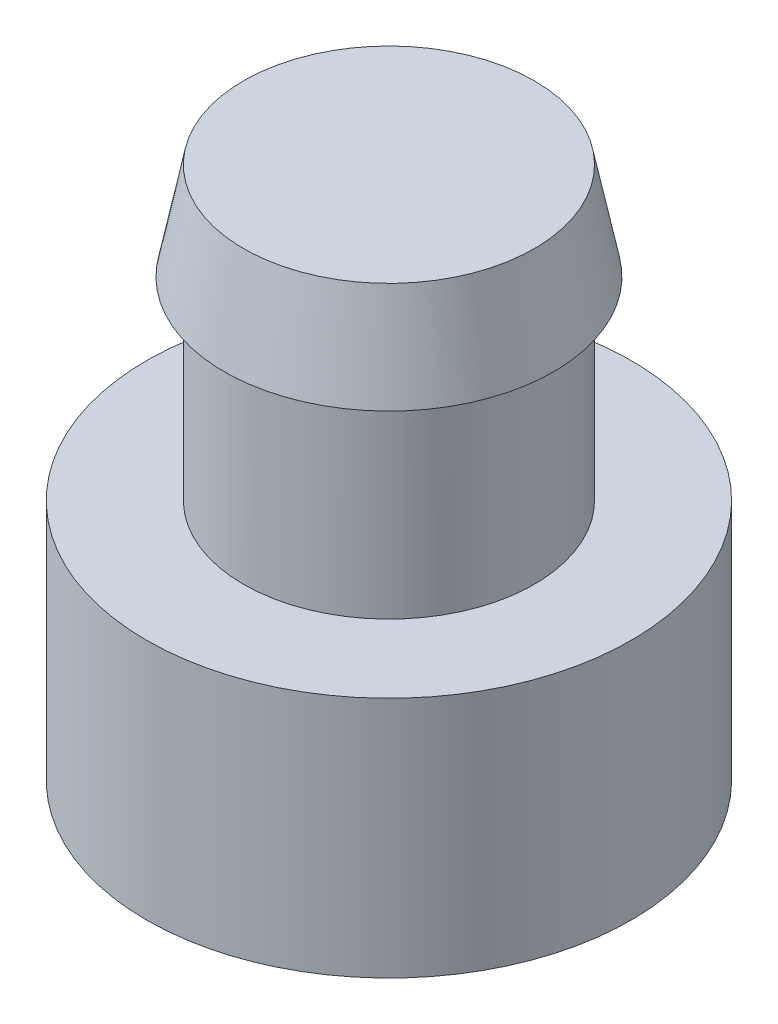
ISO-10303-21;
HEADER;
FILE_DESCRIPTION(('STEP AP214'),'2;1');
FILE_NAME('part.step','',(''),(''),'','','');
FILE_SCHEMA(('AUTOMOTIVE_DESIGN { 1 0 10303 214 1 1 1 1 }'));
ENDSEC;
DATA;
#1=APPLICATION_CONTEXT('core data for automotive mechanical design processes');
#2=APPLICATION_PROTOCOL_DEFINITION('international standard','automotive_design',2000,#1);
#3=PRODUCT_CONTEXT('',#1,'mechanical');
#4=PRODUCT('Part','Part','',(#3));
#5=PRODUCT_RELATED_PRODUCT_CATEGORY('part','',(#4));
#6=PRODUCT_DEFINITION_FORMATION('','',#4);
#7=PRODUCT_DEFINITION_CONTEXT('part definition',#1,'design');
#8=PRODUCT_DEFINITION('design','',#6,#7);
#9=PRODUCT_DEFINITION_SHAPE('','',#8);
#10=(LENGTH_UNIT() NAMED_UNIT(*) SI_UNIT(.MILLI.,.METRE.));
#11=(NAMED_UNIT(*) PLANE_ANGLE_UNIT() SI_UNIT($,.RADIAN.));
#12=(NAMED_UNIT(*) SI_UNIT($,.STERADIAN.) SOLID_ANGLE_UNIT());
#13=UNCERTAINTY_MEASURE_WITH_UNIT(LENGTH_MEASURE(1.E-05),#10,'distance_accuracy_value','');
#14=(GEOMETRIC_REPRESENTATION_CONTEXT(3) GLOBAL_UNCERTAINTY_ASSIGNED_CONTEXT((#13)) GLOBAL_UNIT_ASSIGNED_CONTEXT((#10,
#11,#12)) REPRESENTATION_CONTEXT('',''));
#15=CARTESIAN_POINT('',(0.,0.,0.));
#16=DIRECTION('',(0.,0.,1.));
#17=DIRECTION('',(1.,0.,0.));
#18=AXIS2_PLACEMENT_3D('',#15,#16,#17);
#19=CARTESIAN_POINT('',(0.,2.5,0.));
#20=DIRECTION('',(0.,-1.,0.));
#21=DIRECTION('',(0.,0.,-1.));
#22=AXIS2_PLACEMENT_3D('',#19,#20,#21);
#23=CYLINDRICAL_SURFACE('',#22,2.5);
#24=CARTESIAN_POINT('',(0.,2.5,0.));
#25=DIRECTION('',(0.,1.,0.));
#26=DIRECTION('',(0.,0.,1.));
#27=AXIS2_PLACEMENT_3D('',#24,#25,#26);
#28=CIRCLE('',#27,2.5);
#29=CARTESIAN_POINT('',(0.,2.5,2.5));
#30=VERTEX_POINT('',#29);
#31=EDGE_CURVE('E38',#30,#30,#28,.T.);
#32=ORIENTED_EDGE('',*,*,#31,.F.);
#33=EDGE_LOOP('',(#32));
#34=FACE_BOUND('',#33,.T.);
#35=CARTESIAN_POINT('',(0.,0.,0.));
#36=DIRECTION('',(0.,1.,0.));
#37=DIRECTION('',(0.,0.,1.));
#38=AXIS2_PLACEMENT_3D('',#35,#36,#37);
#39=CIRCLE('',#38,2.5);
#40=CARTESIAN_POINT('',(0.,0.,2.5));
#41=VERTEX_POINT('',#40);
#42=EDGE_CURVE('E34',#41,#41,#39,.T.);
#43=ORIENTED_EDGE('',*,*,#42,.T.);
#44=EDGE_LOOP('',(#43));
#45=FACE_BOUND('',#44,.T.);
#46=ADVANCED_FACE('F31',(#34,#45),#23,.T.);
#47=CARTESIAN_POINT('',(0.,2.5,0.));
#48=DIRECTION('',(0.,1.,0.));
#49=DIRECTION('',(0.,0.,1.));
#50=AXIS2_PLACEMENT_3D('',#47,#48,#49);
#51=PLANE('',#50);
#52=CARTESIAN_POINT('',(0.,2.5,0.));
#53=DIRECTION('',(0.,1.,0.));
#54=DIRECTION('',(0.,0.,1.));
#55=AXIS2_PLACEMENT_3D('',#52,#53,#54);
#56=CIRCLE('',#55,1.5);
#57=CARTESIAN_POINT('',(0.,2.5,1.5));
#58=VERTEX_POINT('',#57);
#59=EDGE_CURVE('E10',#58,#58,#56,.T.);
#60=ORIENTED_EDGE('',*,*,#59,.F.);
#61=EDGE_LOOP('',(#60));
#62=FACE_BOUND('',#61,.T.);
#63=ORIENTED_EDGE('',*,*,#31,.T.);
#64=EDGE_LOOP('',(#63));
#65=FACE_BOUND('',#64,.T.);
#66=ADVANCED_FACE('F69',(#62,#65),#51,.T.);
#67=CARTESIAN_POINT('',(0.,0.,0.));
#68=DIRECTION('',(0.,1.,0.));
#69=DIRECTION('',(0.,0.,1.));
#70=AXIS2_PLACEMENT_3D('',#67,#68,#69);
#71=PLANE('',#70);
#72=ORIENTED_EDGE('',*,*,#42,.F.);
#73=EDGE_LOOP('',(#72));
#74=FACE_BOUND('',#73,.T.);
#75=ADVANCED_FACE('F74',(#74),#71,.F.);
#76=CARTESIAN_POINT('',(0.,5.5,0.));
#77=DIRECTION('',(0.,-1.,0.));
#78=DIRECTION('',(0.,0.,-1.));
#79=AXIS2_PLACEMENT_3D('',#76,#77,#78);
#80=CYLINDRICAL_SURFACE('',#79,1.5);
#81=CARTESIAN_POINT('',(0.,4.5,0.));
#82=DIRECTION('',(0.,-1.,0.));
#83=DIRECTION('',(0.,0.,-1.));
#84=AXIS2_PLACEMENT_3D('',#81,#82,#83);
#85=CIRCLE('',#84,1.5);
#86=CARTESIAN_POINT('',(0.,4.5,-1.5));
#87=VERTEX_POINT('',#86);
#88=EDGE_CURVE('E47',#87,#87,#85,.T.);
#89=ORIENTED_EDGE('',*,*,#88,.T.);
#90=EDGE_LOOP('',(#89));
#91=FACE_BOUND('',#90,.T.);
#92=ORIENTED_EDGE('',*,*,#59,.T.);
#93=EDGE_LOOP('',(#92));
#94=FACE_BOUND('',#93,.T.);
#95=ADVANCED_FACE('F83',(#91,#94),#80,.T.);
#96=CARTESIAN_POINT('',(0.,4.5,0.));
#97=DIRECTION('',(0.,-1.,0.));
#98=DIRECTION('',(0.,0.,-1.));
#99=AXIS2_PLACEMENT_3D('',#96,#97,#98);
#100=CONICAL_SURFACE('',#99,1.7,0.197395559849881);
#101=CARTESIAN_POINT('',(0.,5.5,0.));
#102=DIRECTION('',(0.,-1.,0.));
#103=DIRECTION('',(0.,0.,-1.));
#104=AXIS2_PLACEMENT_3D('',#101,#102,#103);
#105=CIRCLE('',#104,1.5);
#106=CARTESIAN_POINT('',(0.,5.5,-1.5));
#107=VERTEX_POINT('',#106);
#108=EDGE_CURVE('E50',#107,#107,#105,.T.);
#109=ORIENTED_EDGE('',*,*,#108,.T.);
#110=EDGE_LOOP('',(#109));
#111=FACE_BOUND('',#110,.T.);
#112=CARTESIAN_POINT('',(0.,4.5,0.));
#113=DIRECTION('',(0.,-1.,0.));
#114=DIRECTION('',(0.,0.,-1.));
#115=AXIS2_PLACEMENT_3D('',#112,#113,#114);
#116=CIRCLE('',#115,1.7);
#117=CARTESIAN_POINT('',(0.,4.5,-1.7));
#118=VERTEX_POINT('',#117);
#119=EDGE_CURVE('E44',#118,#118,#116,.T.);
#120=ORIENTED_EDGE('',*,*,#119,.F.);
#121=EDGE_LOOP('',(#120));
#122=FACE_BOUND('',#121,.T.);
#123=ADVANCED_FACE('F54',(#111,#122),#100,.T.);
#124=CARTESIAN_POINT('',(1.5,4.5,0.));
#125=DIRECTION('',(0.,-1.,0.));
#126=DIRECTION('',(0.,0.,-1.));
#127=AXIS2_PLACEMENT_3D('',#124,#125,#126);
#128=PLANE('',#127);
#129=ORIENTED_EDGE('',*,*,#119,.T.);
#130=EDGE_LOOP('',(#129));
#131=FACE_BOUND('',#130,.T.);
#132=ORIENTED_EDGE('',*,*,#88,.F.);
#133=EDGE_LOOP('',(#132));
#134=FACE_BOUND('',#133,.T.);
#135=ADVANCED_FACE('F59',(#131,#134),#128,.T.);
#136=CARTESIAN_POINT('',(0.,5.5,0.));
#137=DIRECTION('',(0.,1.,0.));
#138=DIRECTION('',(0.,0.,1.));
#139=AXIS2_PLACEMENT_3D('',#136,#137,#138);
#140=PLANE('',#139);
#141=ORIENTED_EDGE('',*,*,#108,.F.);
#142=EDGE_LOOP('',(#141));
#143=FACE_BOUND('',#142,.T.);
#144=ADVANCED_FACE('F57',(#143),#140,.T.);
#145=CLOSED_SHELL('',(#46,#66,#75,#95,#123,#135,#144));
#146=MANIFOLD_SOLID_BREP('B2',#145);
#147=ADVANCED_BREP_SHAPE_REPRESENTATION('',(#18,#146),#14);
#148=SHAPE_DEFINITION_REPRESENTATION(#9,#147);
ENDSEC;
END-ISO-10303-21;
